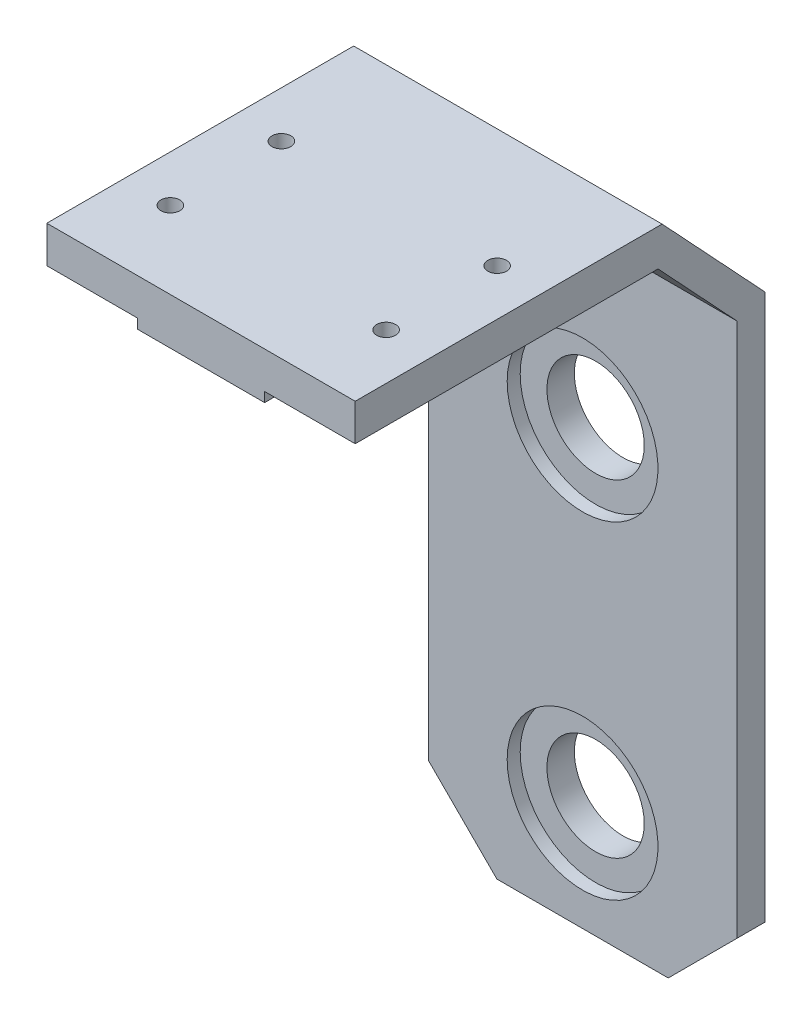
ISO-10303-21;
HEADER;
FILE_DESCRIPTION(('STEP AP214'),'2;1');
FILE_NAME('part.step','',(''),(''),'','','');
FILE_SCHEMA(('AUTOMOTIVE_DESIGN { 1 0 10303 214 1 1 1 1 }'));
ENDSEC;
DATA;
#1=APPLICATION_CONTEXT('core data for automotive mechanical design processes');
#2=APPLICATION_PROTOCOL_DEFINITION('international standard','automotive_design',2000,#1);
#3=PRODUCT_CONTEXT('',#1,'mechanical');
#4=PRODUCT('Part','Part','',(#3));
#5=PRODUCT_RELATED_PRODUCT_CATEGORY('part','',(#4));
#6=PRODUCT_DEFINITION_FORMATION('','',#4);
#7=PRODUCT_DEFINITION_CONTEXT('part definition',#1,'design');
#8=PRODUCT_DEFINITION('design','',#6,#7);
#9=PRODUCT_DEFINITION_SHAPE('','',#8);
#10=(LENGTH_UNIT() NAMED_UNIT(*) SI_UNIT(.MILLI.,.METRE.));
#11=(NAMED_UNIT(*) PLANE_ANGLE_UNIT() SI_UNIT($,.RADIAN.));
#12=(NAMED_UNIT(*) SI_UNIT($,.STERADIAN.) SOLID_ANGLE_UNIT());
#13=UNCERTAINTY_MEASURE_WITH_UNIT(LENGTH_MEASURE(1.E-05),#10,'distance_accuracy_value','');
#14=(GEOMETRIC_REPRESENTATION_CONTEXT(3) GLOBAL_UNCERTAINTY_ASSIGNED_CONTEXT((#13)) GLOBAL_UNIT_ASSIGNED_CONTEXT((#10,
#11,#12)) REPRESENTATION_CONTEXT('',''));
#15=CARTESIAN_POINT('',(0.,0.,0.));
#16=DIRECTION('',(0.,0.,1.));
#17=DIRECTION('',(1.,0.,0.));
#18=AXIS2_PLACEMENT_3D('',#15,#16,#17);
#19=CARTESIAN_POINT('',(0.,0.,4.));
#20=DIRECTION('',(0.,0.,-1.));
#21=DIRECTION('',(-1.,0.,0.));
#22=AXIS2_PLACEMENT_3D('',#19,#20,#21);
#23=PLANE('',#22);
#24=CARTESIAN_POINT('',(0.,19.65,4.));
#25=DIRECTION('',(0.,0.,1.));
#26=DIRECTION('',(1.,0.,0.));
#27=AXIS2_PLACEMENT_3D('',#24,#25,#26);
#28=CIRCLE('',#27,11.);
#29=CARTESIAN_POINT('',(-11.,19.65,4.));
#30=VERTEX_POINT('',#29);
#31=EDGE_CURVE('E210',#30,#30,#28,.T.);
#32=ORIENTED_EDGE('',*,*,#31,.T.);
#33=EDGE_LOOP('',(#32));
#34=FACE_BOUND('',#33,.T.);
#35=CARTESIAN_POINT('',(0.,19.65,4.));
#36=DIRECTION('',(0.,0.,1.));
#37=DIRECTION('',(1.,0.,0.));
#38=AXIS2_PLACEMENT_3D('',#35,#36,#37);
#39=CIRCLE('',#38,7.1);
#40=CARTESIAN_POINT('',(7.1,19.65,4.));
#41=VERTEX_POINT('',#40);
#42=EDGE_CURVE('E307',#41,#41,#39,.T.);
#43=ORIENTED_EDGE('',*,*,#42,.F.);
#44=EDGE_LOOP('',(#43));
#45=FACE_BOUND('',#44,.T.);
#46=ADVANCED_FACE('F45',(#34,#45),#23,.F.);
#47=CARTESIAN_POINT('',(-22.5,56.3434052044111,-0.001000000000001));
#48=DIRECTION('',(0.,-1.,0.));
#49=DIRECTION('',(1.,0.,0.));
#50=AXIS2_PLACEMENT_3D('',#47,#48,#49);
#51=PLANE('',#50);
#52=CARTESIAN_POINT('',(-15.7430140650594,56.3434052044111,50.2990425341615));
#53=DIRECTION('',(0.,-1.,0.));
#54=DIRECTION('',(1.,0.,0.));
#55=AXIS2_PLACEMENT_3D('',#52,#53,#54);
#56=CIRCLE('',#55,1.37500000000098);
#57=CARTESIAN_POINT('',(-14.3680140650584,56.3434052044111,50.2990425341615));
#58=VERTEX_POINT('',#57);
#59=EDGE_CURVE('E230',#58,#58,#56,.T.);
#60=ORIENTED_EDGE('',*,*,#59,.F.);
#61=EDGE_LOOP('',(#60));
#62=FACE_BOUND('',#61,.T.);
#63=CARTESIAN_POINT('',(-15.7430140650594,56.3434052044111,34.097127602533));
#64=DIRECTION('',(0.,-1.,0.));
#65=DIRECTION('',(1.,0.,0.));
#66=AXIS2_PLACEMENT_3D('',#63,#64,#65);
#67=CIRCLE('',#66,1.37500000000098);
#68=CARTESIAN_POINT('',(-14.3680140650584,56.3434052044111,34.097127602533));
#69=VERTEX_POINT('',#68);
#70=EDGE_CURVE('E227',#69,#69,#67,.T.);
#71=ORIENTED_EDGE('',*,*,#70,.F.);
#72=EDGE_LOOP('',(#71));
#73=FACE_BOUND('',#72,.T.);
#74=DIRECTION('',(0.,0.,1.));
#75=VECTOR('',#74,1.);
#76=CARTESIAN_POINT('',(-9.29301406505979,56.3434052044112,17.3859705314257));
#77=LINE('',#76,#75);
#78=CARTESIAN_POINT('',(-9.29301406505979,56.3434052044112,17.3859705314257));
#79=VERTEX_POINT('',#78);
#80=CARTESIAN_POINT('',(-9.29301406505979,56.3434052044112,61.5750000000001));
#81=VERTEX_POINT('',#80);
#82=EDGE_CURVE('E262',#79,#81,#77,.T.);
#83=ORIENTED_EDGE('',*,*,#82,.T.);
#84=DIRECTION('',(-1.,0.,0.));
#85=VECTOR('',#84,1.);
#86=CARTESIAN_POINT('',(-22.5,56.3434052044111,61.5750000000002));
#87=LINE('',#86,#85);
#88=CARTESIAN_POINT('',(-22.5,56.3434052044111,61.5750000000002));
#89=VERTEX_POINT('',#88);
#90=EDGE_CURVE('E275',#81,#89,#87,.T.);
#91=ORIENTED_EDGE('',*,*,#90,.T.);
#92=DIRECTION('',(0.,0.,1.));
#93=VECTOR('',#92,1.);
#94=CARTESIAN_POINT('',(-22.5,56.3434052044111,-0.001000000000001));
#95=LINE('',#94,#93);
#96=CARTESIAN_POINT('',(-22.5,56.3434052044111,17.3859705314257));
#97=VERTEX_POINT('',#96);
#98=EDGE_CURVE('E288',#97,#89,#95,.T.);
#99=ORIENTED_EDGE('',*,*,#98,.F.);
#100=DIRECTION('',(1.,0.,0.));
#101=VECTOR('',#100,1.);
#102=CARTESIAN_POINT('',(-49.4674388968405,56.3434052044112,17.3859705314257));
#103=LINE('',#102,#101);
#104=EDGE_CURVE('E296',#97,#79,#103,.T.);
#105=ORIENTED_EDGE('',*,*,#104,.T.);
#106=EDGE_LOOP('',(#83,#91,#99,#105));
#107=FACE_BOUND('',#106,.T.);
#108=ADVANCED_FACE('F415',(#62,#73,#107),#51,.T.);
#109=CARTESIAN_POINT('',(0.,-28.15,4.));
#110=DIRECTION('',(0.,0.,1.));
#111=DIRECTION('',(1.,0.,0.));
#112=AXIS2_PLACEMENT_3D('',#109,#110,#111);
#113=CIRCLE('',#112,11.);
#114=CARTESIAN_POINT('',(-11.,-28.15,4.));
#115=VERTEX_POINT('',#114);
#116=EDGE_CURVE('E207',#115,#115,#113,.T.);
#117=ORIENTED_EDGE('',*,*,#116,.T.);
#118=EDGE_LOOP('',(#117));
#119=FACE_BOUND('',#118,.T.);
#120=CARTESIAN_POINT('',(0.,-28.15,4.));
#121=DIRECTION('',(0.,0.,1.));
#122=DIRECTION('',(1.,0.,0.));
#123=AXIS2_PLACEMENT_3D('',#120,#121,#122);
#124=CIRCLE('',#123,7.1);
#125=CARTESIAN_POINT('',(7.1,-28.15,4.));
#126=VERTEX_POINT('',#125);
#127=EDGE_CURVE('E301',#126,#126,#124,.T.);
#128=ORIENTED_EDGE('',*,*,#127,.F.);
#129=EDGE_LOOP('',(#128));
#130=FACE_BOUND('',#129,.T.);
#131=ADVANCED_FACE('F437',(#119,#130),#23,.F.);
#132=CARTESIAN_POINT('',(0.,0.,0.));
#133=DIRECTION('',(0.,0.,-1.));
#134=DIRECTION('',(-1.,0.,0.));
#135=AXIS2_PLACEMENT_3D('',#132,#133,#134);
#136=PLANE('',#135);
#137=CARTESIAN_POINT('',(0.,19.65,0.));
#138=DIRECTION('',(0.,0.,1.));
#139=DIRECTION('',(1.,0.,0.));
#140=AXIS2_PLACEMENT_3D('',#137,#138,#139);
#141=CIRCLE('',#140,7.1);
#142=CARTESIAN_POINT('',(7.1,19.65,0.));
#143=VERTEX_POINT('',#142);
#144=EDGE_CURVE('E304',#143,#143,#141,.T.);
#145=ORIENTED_EDGE('',*,*,#144,.T.);
#146=EDGE_LOOP('',(#145));
#147=FACE_BOUND('',#146,.T.);
#148=DIRECTION('',(-0.707106781186546,0.707106781186549,0.));
#149=VECTOR('',#148,1.);
#150=CARTESIAN_POINT('',(-27.0125631329236,-27.0125631329235,0.));
#151=LINE('',#150,#149);
#152=CARTESIAN_POINT('',(-11.7751262658471,-42.25,0.));
#153=VERTEX_POINT('',#152);
#154=CARTESIAN_POINT('',(-20.75,-33.275126265847,0.));
#155=VERTEX_POINT('',#154);
#156=EDGE_CURVE('E339',#153,#155,#151,.T.);
#157=ORIENTED_EDGE('',*,*,#156,.T.);
#158=DIRECTION('',(0.,1.,0.));
#159=VECTOR('',#158,1.);
#160=CARTESIAN_POINT('',(-20.75,43.7206459778937,0.));
#161=LINE('',#160,#159);
#162=CARTESIAN_POINT('',(-20.75,43.7206459778937,0.));
#163=VERTEX_POINT('',#162);
#164=EDGE_CURVE('E341',#155,#163,#161,.T.);
#165=ORIENTED_EDGE('',*,*,#164,.T.);
#166=DIRECTION('',(1.,0.,0.));
#167=VECTOR('',#166,1.);
#168=CARTESIAN_POINT('',(-49.3860555271444,43.7206459778937,0.));
#169=LINE('',#168,#167);
#170=CARTESIAN_POINT('',(20.75,43.7206459778937,0.));
#171=VERTEX_POINT('',#170);
#172=EDGE_CURVE('E241',#163,#171,#169,.T.);
#173=ORIENTED_EDGE('',*,*,#172,.T.);
#174=DIRECTION('',(0.,-1.,0.));
#175=VECTOR('',#174,1.);
#176=CARTESIAN_POINT('',(20.75,-34.,0.));
#177=LINE('',#176,#175);
#178=CARTESIAN_POINT('',(20.75,-33.2751262658471,0.));
#179=VERTEX_POINT('',#178);
#180=EDGE_CURVE('E333',#171,#179,#177,.T.);
#181=ORIENTED_EDGE('',*,*,#180,.T.);
#182=DIRECTION('',(-0.707106781186549,-0.707106781186546,0.));
#183=VECTOR('',#182,1.);
#184=CARTESIAN_POINT('',(27.0125631329235,-27.0125631329236,0.));
#185=LINE('',#184,#183);
#186=CARTESIAN_POINT('',(11.775126265847,-42.25,0.));
#187=VERTEX_POINT('',#186);
#188=EDGE_CURVE('E335',#179,#187,#185,.T.);
#189=ORIENTED_EDGE('',*,*,#188,.T.);
#190=DIRECTION('',(-1.,0.,0.));
#191=VECTOR('',#190,1.);
#192=CARTESIAN_POINT('',(-12.5,-42.25,0.));
#193=LINE('',#192,#191);
#194=EDGE_CURVE('E337',#187,#153,#193,.T.);
#195=ORIENTED_EDGE('',*,*,#194,.T.);
#196=EDGE_LOOP('',(#157,#165,#173,#181,#189,#195));
#197=FACE_BOUND('',#196,.T.);
#198=CARTESIAN_POINT('',(0.,-28.15,0.));
#199=DIRECTION('',(0.,0.,1.));
#200=DIRECTION('',(1.,0.,0.));
#201=AXIS2_PLACEMENT_3D('',#198,#199,#200);
#202=CIRCLE('',#201,7.1);
#203=CARTESIAN_POINT('',(7.1,-28.15,0.));
#204=VERTEX_POINT('',#203);
#205=EDGE_CURVE('E295',#204,#204,#202,.T.);
#206=ORIENTED_EDGE('',*,*,#205,.T.);
#207=EDGE_LOOP('',(#206));
#208=FACE_BOUND('',#207,.T.);
#209=ADVANCED_FACE('F448',(#147,#197,#208),#136,.T.);
#210=CARTESIAN_POINT('',(-22.5,-44.,4.));
#211=DIRECTION('',(1.,0.,0.));
#212=DIRECTION('',(0.,1.,0.));
#213=AXIS2_PLACEMENT_3D('',#210,#211,#212);
#214=PLANE('',#213);
#215=DIRECTION('',(0.,-1.,0.));
#216=VECTOR('',#215,1.);
#217=CARTESIAN_POINT('',(-22.5,0.,5.9));
#218=LINE('',#217,#216);
#219=CARTESIAN_POINT('',(-22.5,44.0358979443741,5.9));
#220=VERTEX_POINT('',#219);
#221=CARTESIAN_POINT('',(-22.5,-34.,5.9));
#222=VERTEX_POINT('',#221);
#223=EDGE_CURVE('E194',#220,#222,#218,.T.);
#224=ORIENTED_EDGE('',*,*,#223,.F.);
#225=DIRECTION('',(0.,0.731085971705988,0.682285352308484));
#226=VECTOR('',#225,1.);
#227=CARTESIAN_POINT('',(-22.5,42.,4.));
#228=LINE('',#227,#226);
#229=EDGE_CURVE('E64',#220,#97,#228,.T.);
#230=ORIENTED_EDGE('',*,*,#229,.T.);
#231=ORIENTED_EDGE('',*,*,#98,.T.);
#232=DIRECTION('',(0.,1.,0.));
#233=VECTOR('',#232,1.);
#234=CARTESIAN_POINT('',(-22.5,61.7155162704073,61.5750000000002));
#235=LINE('',#234,#233);
#236=CARTESIAN_POINT('',(-22.5,61.7155162704073,61.5750000000002));
#237=VERTEX_POINT('',#236);
#238=EDGE_CURVE('E278',#89,#237,#235,.T.);
#239=ORIENTED_EDGE('',*,*,#238,.T.);
#240=DIRECTION('',(0.,0.,-1.));
#241=VECTOR('',#240,1.);
#242=CARTESIAN_POINT('',(-22.5,61.7155162704073,58.28));
#243=LINE('',#242,#241);
#244=CARTESIAN_POINT('',(-22.5,61.7155162704073,16.7936971743874));
#245=VERTEX_POINT('',#244);
#246=EDGE_CURVE('E281',#237,#245,#243,.T.);
#247=ORIENTED_EDGE('',*,*,#246,.T.);
#248=DIRECTION('',(0.,-0.731085971705988,-0.682285352308484));
#249=VECTOR('',#248,1.);
#250=CARTESIAN_POINT('',(-22.5,61.7155162704073,16.7936971743874));
#251=LINE('',#250,#249);
#252=CARTESIAN_POINT('',(-22.5,45.5958151371856,1.74999999999998));
#253=VERTEX_POINT('',#252);
#254=EDGE_CURVE('E235',#245,#253,#251,.T.);
#255=ORIENTED_EDGE('',*,*,#254,.T.);
#256=DIRECTION('',(0.,-1.,0.));
#257=VECTOR('',#256,1.);
#258=CARTESIAN_POINT('',(-22.5,-33.9999999999999,1.74999999999999));
#259=LINE('',#258,#257);
#260=CARTESIAN_POINT('',(-22.5,-33.9999999999999,1.74999999999999));
#261=VERTEX_POINT('',#260);
#262=EDGE_CURVE('E330',#253,#261,#259,.T.);
#263=ORIENTED_EDGE('',*,*,#262,.T.);
#264=DIRECTION('',(0.,0.,1.));
#265=VECTOR('',#264,1.);
#266=CARTESIAN_POINT('',(-22.5,-33.9999999999999,4.));
#267=LINE('',#266,#265);
#268=EDGE_CURVE('E328',#261,#222,#267,.T.);
#269=ORIENTED_EDGE('',*,*,#268,.T.);
#270=EDGE_LOOP('',(#224,#230,#231,#239,#247,#255,#263,#269));
#271=FACE_BOUND('',#270,.T.);
#272=ADVANCED_FACE('F454',(#271),#214,.F.);
#273=CARTESIAN_POINT('',(-22.5,-44.,4.));
#274=DIRECTION('',(0.,1.,0.));
#275=DIRECTION('',(0.,0.,1.));
#276=AXIS2_PLACEMENT_3D('',#273,#274,#275);
#277=PLANE('',#276);
#278=DIRECTION('',(0.,0.,-1.));
#279=VECTOR('',#278,1.);
#280=CARTESIAN_POINT('',(-12.5,-44.,4.));
#281=LINE('',#280,#279);
#282=CARTESIAN_POINT('',(-12.5,-44.,5.9));
#283=VERTEX_POINT('',#282);
#284=CARTESIAN_POINT('',(-12.5,-44.,1.74999999999999));
#285=VERTEX_POINT('',#284);
#286=EDGE_CURVE('E168',#283,#285,#281,.T.);
#287=ORIENTED_EDGE('',*,*,#286,.T.);
#288=DIRECTION('',(1.,0.,0.));
#289=VECTOR('',#288,1.);
#290=CARTESIAN_POINT('',(12.4999999999999,-44.,1.74999999999999));
#291=LINE('',#290,#289);
#292=CARTESIAN_POINT('',(12.4999999999999,-44.,1.74999999999999));
#293=VERTEX_POINT('',#292);
#294=EDGE_CURVE('E348',#285,#293,#291,.T.);
#295=ORIENTED_EDGE('',*,*,#294,.T.);
#296=DIRECTION('',(0.,0.,1.));
#297=VECTOR('',#296,1.);
#298=CARTESIAN_POINT('',(12.4999999999999,-44.,4.));
#299=LINE('',#298,#297);
#300=CARTESIAN_POINT('',(12.5,-44.,5.9));
#301=VERTEX_POINT('',#300);
#302=EDGE_CURVE('E178',#293,#301,#299,.T.);
#303=ORIENTED_EDGE('',*,*,#302,.T.);
#304=DIRECTION('',(1.,0.,0.));
#305=VECTOR('',#304,1.);
#306=CARTESIAN_POINT('',(0.,-44.,5.9));
#307=LINE('',#306,#305);
#308=EDGE_CURVE('E182',#283,#301,#307,.T.);
#309=ORIENTED_EDGE('',*,*,#308,.F.);
#310=EDGE_LOOP('',(#287,#295,#303,#309));
#311=FACE_BOUND('',#310,.T.);
#312=ADVANCED_FACE('F183',(#311),#277,.F.);
#313=CARTESIAN_POINT('',(22.5,-44.,4.));
#314=DIRECTION('',(-1.,0.,0.));
#315=DIRECTION('',(0.,-1.,0.));
#316=AXIS2_PLACEMENT_3D('',#313,#314,#315);
#317=PLANE('',#316);
#318=DIRECTION('',(0.,-0.731085971705988,-0.682285352308484));
#319=VECTOR('',#318,1.);
#320=CARTESIAN_POINT('',(22.5,42.,4.));
#321=LINE('',#320,#319);
#322=CARTESIAN_POINT('',(22.5,56.3434052044112,17.3859705314257));
#323=VERTEX_POINT('',#322);
#324=CARTESIAN_POINT('',(22.5,44.0358979443741,5.9));
#325=VERTEX_POINT('',#324);
#326=EDGE_CURVE('E291',#323,#325,#321,.T.);
#327=ORIENTED_EDGE('',*,*,#326,.T.);
#328=DIRECTION('',(0.,1.,0.));
#329=VECTOR('',#328,1.);
#330=CARTESIAN_POINT('',(22.5,0.,5.9));
#331=LINE('',#330,#329);
#332=CARTESIAN_POINT('',(22.5,-34.,5.9));
#333=VERTEX_POINT('',#332);
#334=EDGE_CURVE('E203',#333,#325,#331,.T.);
#335=ORIENTED_EDGE('',*,*,#334,.F.);
#336=DIRECTION('',(0.,0.,-1.));
#337=VECTOR('',#336,1.);
#338=CARTESIAN_POINT('',(22.5,-34.,4.));
#339=LINE('',#338,#337);
#340=CARTESIAN_POINT('',(22.5,-34.,1.74999999999999));
#341=VERTEX_POINT('',#340);
#342=EDGE_CURVE('E179',#333,#341,#339,.T.);
#343=ORIENTED_EDGE('',*,*,#342,.T.);
#344=DIRECTION('',(0.,1.,0.));
#345=VECTOR('',#344,1.);
#346=CARTESIAN_POINT('',(22.5,43.7206459778937,1.74999999999999));
#347=LINE('',#346,#345);
#348=CARTESIAN_POINT('',(22.5,45.5958151371856,1.74999999999998));
#349=VERTEX_POINT('',#348);
#350=EDGE_CURVE('E54',#341,#349,#347,.T.);
#351=ORIENTED_EDGE('',*,*,#350,.T.);
#352=DIRECTION('',(0.,0.731085971705988,0.682285352308484));
#353=VECTOR('',#352,1.);
#354=CARTESIAN_POINT('',(22.5,61.7155162704073,16.7936971743874));
#355=LINE('',#354,#353);
#356=CARTESIAN_POINT('',(22.5,61.7155162704073,16.7936971743874));
#357=VERTEX_POINT('',#356);
#358=EDGE_CURVE('E234',#349,#357,#355,.T.);
#359=ORIENTED_EDGE('',*,*,#358,.T.);
#360=DIRECTION('',(0.,0.,-1.));
#361=VECTOR('',#360,1.);
#362=CARTESIAN_POINT('',(22.5,61.7155162704073,58.28));
#363=LINE('',#362,#361);
#364=CARTESIAN_POINT('',(22.5,61.7155162704073,61.5750000000001));
#365=VERTEX_POINT('',#364);
#366=EDGE_CURVE('E285',#365,#357,#363,.T.);
#367=ORIENTED_EDGE('',*,*,#366,.F.);
#368=DIRECTION('',(0.,-1.,0.));
#369=VECTOR('',#368,1.);
#370=CARTESIAN_POINT('',(22.5,56.3434052044112,61.5750000000001));
#371=LINE('',#370,#369);
#372=CARTESIAN_POINT('',(22.5,56.3434052044112,61.5750000000001));
#373=VERTEX_POINT('',#372);
#374=EDGE_CURVE('E272',#365,#373,#371,.T.);
#375=ORIENTED_EDGE('',*,*,#374,.T.);
#376=DIRECTION('',(0.,0.,1.));
#377=VECTOR('',#376,1.);
#378=CARTESIAN_POINT('',(22.5,56.3434052044112,-0.001000000000001));
#379=LINE('',#378,#377);
#380=EDGE_CURVE('E289',#323,#373,#379,.T.);
#381=ORIENTED_EDGE('',*,*,#380,.F.);
#382=EDGE_LOOP('',(#327,#335,#343,#351,#359,#367,#375,#381));
#383=FACE_BOUND('',#382,.T.);
#384=ADVANCED_FACE('F372',(#383),#317,.F.);
#385=CARTESIAN_POINT('',(0.,19.65,4.));
#386=DIRECTION('',(0.,0.,-1.));
#387=DIRECTION('',(-1.,0.,0.));
#388=AXIS2_PLACEMENT_3D('',#385,#386,#387);
#389=CYLINDRICAL_SURFACE('',#388,7.1);
#390=ORIENTED_EDGE('',*,*,#42,.T.);
#391=EDGE_LOOP('',(#390));
#392=FACE_BOUND('',#391,.T.);
#393=ORIENTED_EDGE('',*,*,#144,.F.);
#394=EDGE_LOOP('',(#393));
#395=FACE_BOUND('',#394,.T.);
#396=ADVANCED_FACE('F463',(#392,#395),#389,.F.);
#397=CARTESIAN_POINT('',(0.,-28.15,4.));
#398=DIRECTION('',(0.,0.,-1.));
#399=DIRECTION('',(-1.,0.,0.));
#400=AXIS2_PLACEMENT_3D('',#397,#398,#399);
#401=CYLINDRICAL_SURFACE('',#400,7.1);
#402=ORIENTED_EDGE('',*,*,#127,.T.);
#403=EDGE_LOOP('',(#402));
#404=FACE_BOUND('',#403,.T.);
#405=ORIENTED_EDGE('',*,*,#205,.F.);
#406=EDGE_LOOP('',(#405));
#407=FACE_BOUND('',#406,.T.);
#408=ADVANCED_FACE('F460',(#404,#407),#401,.F.);
#409=CARTESIAN_POINT('',(-49.4674388968405,42.,4.));
#410=DIRECTION('',(0.,-0.682285352308484,0.731085971705988));
#411=DIRECTION('',(0.,-0.731085971705988,-0.682285352308484));
#412=AXIS2_PLACEMENT_3D('',#409,#410,#411);
#413=PLANE('',#412);
#414=DIRECTION('',(-1.,0.,0.));
#415=VECTOR('',#414,1.);
#416=CARTESIAN_POINT('',(-49.4674388968405,44.0358979443741,5.9));
#417=LINE('',#416,#415);
#418=EDGE_CURVE('E11',#325,#220,#417,.T.);
#419=ORIENTED_EDGE('',*,*,#418,.F.);
#420=ORIENTED_EDGE('',*,*,#326,.F.);
#421=CARTESIAN_POINT('',(9.28677330455362,56.3434052044112,17.3859705314257));
#422=VERTEX_POINT('',#421);
#423=EDGE_CURVE('E298',#422,#323,#103,.T.);
#424=ORIENTED_EDGE('',*,*,#423,.F.);
#425=DIRECTION('',(-1.,0.,0.));
#426=VECTOR('',#425,1.);
#427=CARTESIAN_POINT('',(-9.29301406505979,56.3434052044112,17.3859705314257));
#428=LINE('',#427,#426);
#429=EDGE_CURVE('E252',#422,#79,#428,.T.);
#430=ORIENTED_EDGE('',*,*,#429,.T.);
#431=ORIENTED_EDGE('',*,*,#104,.F.);
#432=ORIENTED_EDGE('',*,*,#229,.F.);
#433=EDGE_LOOP('',(#419,#420,#424,#430,#431,#432));
#434=FACE_BOUND('',#433,.T.);
#435=ADVANCED_FACE('F417',(#434),#413,.T.);
#436=CARTESIAN_POINT('',(22.5,61.7155162704073,58.28));
#437=DIRECTION('',(0.,-1.,0.));
#438=DIRECTION('',(1.,0.,0.));
#439=AXIS2_PLACEMENT_3D('',#436,#437,#438);
#440=PLANE('',#439);
#441=CARTESIAN_POINT('',(-15.7430140650594,61.7155162704073,50.2990425341615));
#442=DIRECTION('',(0.,1.,0.));
#443=DIRECTION('',(-1.,0.,0.));
#444=AXIS2_PLACEMENT_3D('',#441,#442,#443);
#445=CIRCLE('',#444,1.37500000000098);
#446=CARTESIAN_POINT('',(-17.1180140650603,61.7155162704073,50.2990425341615));
#447=VERTEX_POINT('',#446);
#448=EDGE_CURVE('E220',#447,#447,#445,.T.);
#449=ORIENTED_EDGE('',*,*,#448,.F.);
#450=EDGE_LOOP('',(#449));
#451=FACE_BOUND('',#450,.T.);
#452=CARTESIAN_POINT('',(-15.7430140650594,61.7155162704073,34.097127602533));
#453=DIRECTION('',(0.,1.,0.));
#454=DIRECTION('',(-1.,0.,0.));
#455=AXIS2_PLACEMENT_3D('',#452,#453,#454);
#456=CIRCLE('',#455,1.37500000000098);
#457=CARTESIAN_POINT('',(-17.1180140650603,61.7155162704073,34.097127602533));
#458=VERTEX_POINT('',#457);
#459=EDGE_CURVE('E217',#458,#458,#456,.T.);
#460=ORIENTED_EDGE('',*,*,#459,.F.);
#461=EDGE_LOOP('',(#460));
#462=FACE_BOUND('',#461,.T.);
#463=CARTESIAN_POINT('',(15.7349999999804,61.7155162704073,34.0971276025452));
#464=DIRECTION('',(0.,1.,0.));
#465=DIRECTION('',(-1.,0.,0.));
#466=AXIS2_PLACEMENT_3D('',#463,#464,#465);
#467=CIRCLE('',#466,1.37500000001583);
#468=CARTESIAN_POINT('',(14.3599999999646,61.7155162704073,34.0971276025452));
#469=VERTEX_POINT('',#468);
#470=EDGE_CURVE('E213',#469,#469,#467,.T.);
#471=ORIENTED_EDGE('',*,*,#470,.F.);
#472=EDGE_LOOP('',(#471));
#473=FACE_BOUND('',#472,.T.);
#474=CARTESIAN_POINT('',(15.7349999999804,61.7155162704073,50.2990425341737));
#475=DIRECTION('',(0.,1.,0.));
#476=DIRECTION('',(-1.,0.,0.));
#477=AXIS2_PLACEMENT_3D('',#474,#475,#476);
#478=CIRCLE('',#477,1.37500000000158);
#479=CARTESIAN_POINT('',(14.3599999999788,61.7155162704073,50.2990425341737));
#480=VERTEX_POINT('',#479);
#481=EDGE_CURVE('E216',#480,#480,#478,.T.);
#482=ORIENTED_EDGE('',*,*,#481,.F.);
#483=EDGE_LOOP('',(#482));
#484=FACE_BOUND('',#483,.T.);
#485=ORIENTED_EDGE('',*,*,#366,.T.);
#486=DIRECTION('',(1.,0.,0.));
#487=VECTOR('',#486,1.);
#488=CARTESIAN_POINT('',(-49.3860555271444,61.7155162704073,16.7936971743874));
#489=LINE('',#488,#487);
#490=EDGE_CURVE('E239',#245,#357,#489,.T.);
#491=ORIENTED_EDGE('',*,*,#490,.F.);
#492=ORIENTED_EDGE('',*,*,#246,.F.);
#493=DIRECTION('',(1.,0.,0.));
#494=VECTOR('',#493,1.);
#495=CARTESIAN_POINT('',(22.5,61.7155162704073,61.5750000000001));
#496=LINE('',#495,#494);
#497=EDGE_CURVE('E265',#237,#365,#496,.T.);
#498=ORIENTED_EDGE('',*,*,#497,.T.);
#499=EDGE_LOOP('',(#485,#491,#492,#498));
#500=FACE_BOUND('',#499,.T.);
#501=ADVANCED_FACE('F380',(#451,#462,#473,#484,#500),#440,.F.);
#502=CARTESIAN_POINT('',(15.7349999999804,56.3434052044112,34.0971276025452));
#503=DIRECTION('',(0.,-1.,0.));
#504=DIRECTION('',(1.,0.,0.));
#505=AXIS2_PLACEMENT_3D('',#502,#503,#504);
#506=CIRCLE('',#505,1.37500000001583);
#507=CARTESIAN_POINT('',(17.1099999999963,56.3434052044112,34.0971276025452));
#508=VERTEX_POINT('',#507);
#509=EDGE_CURVE('E231',#508,#508,#506,.T.);
#510=ORIENTED_EDGE('',*,*,#509,.F.);
#511=EDGE_LOOP('',(#510));
#512=FACE_BOUND('',#511,.T.);
#513=CARTESIAN_POINT('',(15.7349999999804,56.3434052044112,50.2990425341737));
#514=DIRECTION('',(0.,-1.,0.));
#515=DIRECTION('',(1.,0.,0.));
#516=AXIS2_PLACEMENT_3D('',#513,#514,#515);
#517=CIRCLE('',#516,1.37500000000158);
#518=CARTESIAN_POINT('',(17.109999999982,56.3434052044112,50.2990425341737));
#519=VERTEX_POINT('',#518);
#520=EDGE_CURVE('E226',#519,#519,#517,.T.);
#521=ORIENTED_EDGE('',*,*,#520,.F.);
#522=EDGE_LOOP('',(#521));
#523=FACE_BOUND('',#522,.T.);
#524=DIRECTION('',(0.,0.,1.));
#525=VECTOR('',#524,1.);
#526=CARTESIAN_POINT('',(9.28677330455362,56.3434052044112,17.3859705314257));
#527=LINE('',#526,#525);
#528=CARTESIAN_POINT('',(9.28677330455362,56.3434052044112,61.5750000000001));
#529=VERTEX_POINT('',#528);
#530=EDGE_CURVE('E266',#422,#529,#527,.T.);
#531=ORIENTED_EDGE('',*,*,#530,.F.);
#532=ORIENTED_EDGE('',*,*,#423,.T.);
#533=ORIENTED_EDGE('',*,*,#380,.T.);
#534=EDGE_CURVE('E276',#373,#529,#87,.T.);
#535=ORIENTED_EDGE('',*,*,#534,.T.);
#536=EDGE_LOOP('',(#531,#532,#533,#535));
#537=FACE_BOUND('',#536,.T.);
#538=ADVANCED_FACE('F391',(#512,#523,#537),#51,.T.);
#539=CARTESIAN_POINT('',(15.7349999999983,55.0399999999998,61.5750000000001));
#540=DIRECTION('',(0.,0.,-1.));
#541=DIRECTION('',(-1.,0.,0.));
#542=AXIS2_PLACEMENT_3D('',#539,#540,#541);
#543=PLANE('',#542);
#544=ORIENTED_EDGE('',*,*,#534,.F.);
#545=ORIENTED_EDGE('',*,*,#374,.F.);
#546=ORIENTED_EDGE('',*,*,#497,.F.);
#547=ORIENTED_EDGE('',*,*,#238,.F.);
#548=ORIENTED_EDGE('',*,*,#90,.F.);
#549=DIRECTION('',(0.,-1.,0.));
#550=VECTOR('',#549,1.);
#551=CARTESIAN_POINT('',(-9.29301406505979,56.3434052044112,61.5750000000001));
#552=LINE('',#551,#550);
#553=CARTESIAN_POINT('',(-9.29301406505979,54.9336977234331,61.5750000000001));
#554=VERTEX_POINT('',#553);
#555=EDGE_CURVE('E238',#81,#554,#552,.T.);
#556=ORIENTED_EDGE('',*,*,#555,.T.);
#557=DIRECTION('',(1.,0.,0.));
#558=VECTOR('',#557,1.);
#559=CARTESIAN_POINT('',(-9.29301406505979,54.9336977234331,61.5750000000001));
#560=LINE('',#559,#558);
#561=CARTESIAN_POINT('',(9.28677330455361,54.9336977234331,61.5750000000001));
#562=VERTEX_POINT('',#561);
#563=EDGE_CURVE('E257',#554,#562,#560,.T.);
#564=ORIENTED_EDGE('',*,*,#563,.T.);
#565=DIRECTION('',(0.,1.,0.));
#566=VECTOR('',#565,1.);
#567=CARTESIAN_POINT('',(9.28677330455362,56.3434052044112,61.5750000000001));
#568=LINE('',#567,#566);
#569=EDGE_CURVE('E250',#562,#529,#568,.T.);
#570=ORIENTED_EDGE('',*,*,#569,.T.);
#571=EDGE_LOOP('',(#544,#545,#546,#547,#548,#556,#564,#570));
#572=FACE_BOUND('',#571,.T.);
#573=ADVANCED_FACE('F386',(#572),#543,.F.);
#574=CARTESIAN_POINT('',(-9.29301406505979,56.3434052044112,17.3859705314257));
#575=DIRECTION('',(-1.,0.,0.));
#576=DIRECTION('',(0.,0.,1.));
#577=AXIS2_PLACEMENT_3D('',#574,#575,#576);
#578=PLANE('',#577);
#579=DIRECTION('',(0.,-1.,0.));
#580=VECTOR('',#579,1.);
#581=CARTESIAN_POINT('',(-9.29301406505979,56.3434052044112,17.3859705314257));
#582=LINE('',#581,#580);
#583=CARTESIAN_POINT('',(-9.29301406505979,56.3386977234331,17.3859705314257));
#584=VERTEX_POINT('',#583);
#585=EDGE_CURVE('E246',#79,#584,#582,.T.);
#586=ORIENTED_EDGE('',*,*,#585,.T.);
#587=DIRECTION('',(0.,-0.707106781186544,0.707106781186551));
#588=VECTOR('',#587,1.);
#589=CARTESIAN_POINT('',(-9.29301406505979,56.3410514639221,17.3836167909366));
#590=LINE('',#589,#588);
#591=CARTESIAN_POINT('',(-9.29301406505979,54.9336977234331,18.7909705314257));
#592=VERTEX_POINT('',#591);
#593=EDGE_CURVE('E319',#584,#592,#590,.T.);
#594=ORIENTED_EDGE('',*,*,#593,.T.);
#595=DIRECTION('',(0.,0.,1.));
#596=VECTOR('',#595,1.);
#597=CARTESIAN_POINT('',(-9.29301406505979,54.9336977234331,17.3859705314257));
#598=LINE('',#597,#596);
#599=EDGE_CURVE('E254',#592,#554,#598,.T.);
#600=ORIENTED_EDGE('',*,*,#599,.T.);
#601=ORIENTED_EDGE('',*,*,#555,.F.);
#602=ORIENTED_EDGE('',*,*,#82,.F.);
#603=EDGE_LOOP('',(#586,#594,#600,#601,#602));
#604=FACE_BOUND('',#603,.T.);
#605=ADVANCED_FACE('F408',(#604),#578,.T.);
#606=CARTESIAN_POINT('',(9.28677330455362,56.3434052044112,17.3859705314257));
#607=DIRECTION('',(1.,0.,0.));
#608=DIRECTION('',(0.,1.,0.));
#609=AXIS2_PLACEMENT_3D('',#606,#607,#608);
#610=PLANE('',#609);
#611=DIRECTION('',(0.,0.,1.));
#612=VECTOR('',#611,1.);
#613=CARTESIAN_POINT('',(9.28677330455361,54.9336977234331,17.3859705314257));
#614=LINE('',#613,#612);
#615=CARTESIAN_POINT('',(9.28677330455361,54.9336977234331,18.7909705314257));
#616=VERTEX_POINT('',#615);
#617=EDGE_CURVE('E269',#616,#562,#614,.T.);
#618=ORIENTED_EDGE('',*,*,#617,.F.);
#619=DIRECTION('',(0.,0.707106781186544,-0.707106781186551));
#620=VECTOR('',#619,1.);
#621=CARTESIAN_POINT('',(9.28677330455362,56.3410514639221,17.3836167909366));
#622=LINE('',#621,#620);
#623=CARTESIAN_POINT('',(9.28677330455362,56.3386977234331,17.3859705314257));
#624=VERTEX_POINT('',#623);
#625=EDGE_CURVE('E315',#616,#624,#622,.T.);
#626=ORIENTED_EDGE('',*,*,#625,.T.);
#627=DIRECTION('',(0.,1.,0.));
#628=VECTOR('',#627,1.);
#629=CARTESIAN_POINT('',(9.28677330455362,56.3434052044112,17.3859705314257));
#630=LINE('',#629,#628);
#631=EDGE_CURVE('E249',#624,#422,#630,.T.);
#632=ORIENTED_EDGE('',*,*,#631,.T.);
#633=ORIENTED_EDGE('',*,*,#530,.T.);
#634=ORIENTED_EDGE('',*,*,#569,.F.);
#635=EDGE_LOOP('',(#618,#626,#632,#633,#634));
#636=FACE_BOUND('',#635,.T.);
#637=ADVANCED_FACE('F395',(#636),#610,.T.);
#638=CARTESIAN_POINT('',(-9.29301406505979,54.9336977234331,17.3859705314257));
#639=DIRECTION('',(0.,-1.,0.));
#640=DIRECTION('',(0.,0.,-1.));
#641=AXIS2_PLACEMENT_3D('',#638,#639,#640);
#642=PLANE('',#641);
#643=ORIENTED_EDGE('',*,*,#599,.F.);
#644=DIRECTION('',(1.,0.,0.));
#645=VECTOR('',#644,1.);
#646=CARTESIAN_POINT('',(9.28677330455361,54.9336977234331,18.7909705314257));
#647=LINE('',#646,#645);
#648=EDGE_CURVE('E310',#592,#616,#647,.T.);
#649=ORIENTED_EDGE('',*,*,#648,.T.);
#650=ORIENTED_EDGE('',*,*,#617,.T.);
#651=ORIENTED_EDGE('',*,*,#563,.F.);
#652=EDGE_LOOP('',(#643,#649,#650,#651));
#653=FACE_BOUND('',#652,.T.);
#654=ADVANCED_FACE('F413',(#653),#642,.T.);
#655=CARTESIAN_POINT('',(0.,0.,17.3859705314257));
#656=DIRECTION('',(0.,0.,1.));
#657=DIRECTION('',(1.,0.,0.));
#658=AXIS2_PLACEMENT_3D('',#655,#656,#657);
#659=PLANE('',#658);
#660=ORIENTED_EDGE('',*,*,#631,.F.);
#661=DIRECTION('',(-1.,0.,0.));
#662=VECTOR('',#661,1.);
#663=CARTESIAN_POINT('',(-9.29301406505979,56.3386977234331,17.3859705314257));
#664=LINE('',#663,#662);
#665=EDGE_CURVE('E317',#624,#584,#664,.T.);
#666=ORIENTED_EDGE('',*,*,#665,.T.);
#667=ORIENTED_EDGE('',*,*,#585,.F.);
#668=ORIENTED_EDGE('',*,*,#429,.F.);
#669=EDGE_LOOP('',(#660,#666,#667,#668));
#670=FACE_BOUND('',#669,.T.);
#671=ADVANCED_FACE('F400',(#670),#659,.F.);
#672=CARTESIAN_POINT('',(-9.29301406505979,54.9336977234331,18.7909705314257));
#673=DIRECTION('',(0.,-0.707106781186551,-0.707106781186544));
#674=DIRECTION('',(-1.,0.,0.));
#675=AXIS2_PLACEMENT_3D('',#672,#673,#674);
#676=PLANE('',#675);
#677=ORIENTED_EDGE('',*,*,#593,.F.);
#678=ORIENTED_EDGE('',*,*,#665,.F.);
#679=ORIENTED_EDGE('',*,*,#625,.F.);
#680=ORIENTED_EDGE('',*,*,#648,.F.);
#681=EDGE_LOOP('',(#677,#678,#679,#680));
#682=FACE_BOUND('',#681,.T.);
#683=ADVANCED_FACE('F404',(#682),#676,.T.);
#684=CARTESIAN_POINT('',(-49.3860555271444,61.7155162704073,16.7936971743874));
#685=DIRECTION('',(0.,0.682285352308484,-0.731085971705988));
#686=DIRECTION('',(0.,0.731085971705988,0.682285352308484));
#687=AXIS2_PLACEMENT_3D('',#684,#685,#686);
#688=PLANE('',#687);
#689=ORIENTED_EDGE('',*,*,#172,.F.);
#690=DIRECTION('',(-0.563600234749781,0.603911873355694,0.563600234749781));
#691=VECTOR('',#690,1.);
#692=CARTESIAN_POINT('',(-41.3053657532611,65.7462390741681,20.5553657532611));
#693=LINE('',#692,#691);
#694=EDGE_CURVE('E345',#163,#253,#693,.T.);
#695=ORIENTED_EDGE('',*,*,#694,.T.);
#696=ORIENTED_EDGE('',*,*,#254,.F.);
#697=ORIENTED_EDGE('',*,*,#490,.T.);
#698=ORIENTED_EDGE('',*,*,#358,.F.);
#699=DIRECTION('',(-0.56360023474978,-0.603911873355694,-0.563600234749781));
#700=VECTOR('',#699,1.);
#701=CARTESIAN_POINT('',(9.93087635221688,32.1276819808145,-10.8191236477831));
#702=LINE('',#701,#700);
#703=EDGE_CURVE('E343',#349,#171,#702,.T.);
#704=ORIENTED_EDGE('',*,*,#703,.T.);
#705=EDGE_LOOP('',(#689,#695,#696,#697,#698,#704));
#706=FACE_BOUND('',#705,.T.);
#707=ADVANCED_FACE('F376',(#706),#688,.T.);
#708=CARTESIAN_POINT('',(15.7349999999804,-44.,50.2990425341737));
#709=DIRECTION('',(0.,1.,0.));
#710=DIRECTION('',(-1.,0.,0.));
#711=AXIS2_PLACEMENT_3D('',#708,#709,#710);
#712=CYLINDRICAL_SURFACE('',#711,1.37500000000158);
#713=ORIENTED_EDGE('',*,*,#520,.T.);
#714=EDGE_LOOP('',(#713));
#715=FACE_BOUND('',#714,.T.);
#716=ORIENTED_EDGE('',*,*,#481,.T.);
#717=EDGE_LOOP('',(#716));
#718=FACE_BOUND('',#717,.T.);
#719=ADVANCED_FACE('F490',(#715,#718),#712,.F.);
#720=CARTESIAN_POINT('',(15.7349999999804,-44.,34.0971276025452));
#721=DIRECTION('',(0.,1.,0.));
#722=DIRECTION('',(-1.,0.,0.));
#723=AXIS2_PLACEMENT_3D('',#720,#721,#722);
#724=CYLINDRICAL_SURFACE('',#723,1.37500000001583);
#725=ORIENTED_EDGE('',*,*,#509,.T.);
#726=EDGE_LOOP('',(#725));
#727=FACE_BOUND('',#726,.T.);
#728=ORIENTED_EDGE('',*,*,#470,.T.);
#729=EDGE_LOOP('',(#728));
#730=FACE_BOUND('',#729,.T.);
#731=ADVANCED_FACE('F492',(#727,#730),#724,.F.);
#732=CARTESIAN_POINT('',(-15.7430140650594,-44.,34.097127602533));
#733=DIRECTION('',(0.,1.,0.));
#734=DIRECTION('',(-1.,0.,0.));
#735=AXIS2_PLACEMENT_3D('',#732,#733,#734);
#736=CYLINDRICAL_SURFACE('',#735,1.37500000000098);
#737=ORIENTED_EDGE('',*,*,#70,.T.);
#738=EDGE_LOOP('',(#737));
#739=FACE_BOUND('',#738,.T.);
#740=ORIENTED_EDGE('',*,*,#459,.T.);
#741=EDGE_LOOP('',(#740));
#742=FACE_BOUND('',#741,.T.);
#743=ADVANCED_FACE('F429',(#739,#742),#736,.F.);
#744=CARTESIAN_POINT('',(-15.7430140650594,-44.,50.2990425341615));
#745=DIRECTION('',(0.,1.,0.));
#746=DIRECTION('',(-1.,0.,0.));
#747=AXIS2_PLACEMENT_3D('',#744,#745,#746);
#748=CYLINDRICAL_SURFACE('',#747,1.37500000000098);
#749=ORIENTED_EDGE('',*,*,#59,.T.);
#750=EDGE_LOOP('',(#749));
#751=FACE_BOUND('',#750,.T.);
#752=ORIENTED_EDGE('',*,*,#448,.T.);
#753=EDGE_LOOP('',(#752));
#754=FACE_BOUND('',#753,.T.);
#755=ADVANCED_FACE('F421',(#751,#754),#748,.F.);
#756=CARTESIAN_POINT('',(22.5,-34.,4.));
#757=DIRECTION('',(-0.707106781186546,0.707106781186549,0.));
#758=DIRECTION('',(0.,0.,-1.));
#759=AXIS2_PLACEMENT_3D('',#756,#757,#758);
#760=PLANE('',#759);
#761=ORIENTED_EDGE('',*,*,#302,.F.);
#762=DIRECTION('',(-0.707106781186549,-0.707106781186546,0.));
#763=VECTOR('',#762,1.);
#764=CARTESIAN_POINT('',(22.5,-34.,1.74999999999999));
#765=LINE('',#764,#763);
#766=EDGE_CURVE('E350',#293,#341,#765,.F.);
#767=ORIENTED_EDGE('',*,*,#766,.T.);
#768=ORIENTED_EDGE('',*,*,#342,.F.);
#769=DIRECTION('',(0.707106781186549,0.707106781186546,0.));
#770=VECTOR('',#769,1.);
#771=CARTESIAN_POINT('',(28.25,-28.2500000000001,5.9));
#772=LINE('',#771,#770);
#773=EDGE_CURVE('E188',#301,#333,#772,.T.);
#774=ORIENTED_EDGE('',*,*,#773,.F.);
#775=EDGE_LOOP('',(#761,#767,#768,#774));
#776=FACE_BOUND('',#775,.T.);
#777=ADVANCED_FACE('F419',(#776),#760,.F.);
#778=CARTESIAN_POINT('',(-12.5,-44.,4.));
#779=DIRECTION('',(0.707106781186549,0.707106781186546,0.));
#780=DIRECTION('',(0.,0.,-1.));
#781=AXIS2_PLACEMENT_3D('',#778,#779,#780);
#782=PLANE('',#781);
#783=ORIENTED_EDGE('',*,*,#268,.F.);
#784=DIRECTION('',(-0.707106781186546,0.707106781186549,0.));
#785=VECTOR('',#784,1.);
#786=CARTESIAN_POINT('',(-12.5,-44.,1.74999999999999));
#787=LINE('',#786,#785);
#788=EDGE_CURVE('E175',#261,#285,#787,.F.);
#789=ORIENTED_EDGE('',*,*,#788,.T.);
#790=ORIENTED_EDGE('',*,*,#286,.F.);
#791=DIRECTION('',(0.707106781186546,-0.707106781186549,0.));
#792=VECTOR('',#791,1.);
#793=CARTESIAN_POINT('',(-28.25,-28.2499999999999,5.9));
#794=LINE('',#793,#792);
#795=EDGE_CURVE('E173',#222,#283,#794,.T.);
#796=ORIENTED_EDGE('',*,*,#795,.F.);
#797=EDGE_LOOP('',(#783,#789,#790,#796));
#798=FACE_BOUND('',#797,.T.);
#799=ADVANCED_FACE('F171',(#798),#782,.F.);
#800=CARTESIAN_POINT('',(22.5,-44.,1.74999999999999));
#801=DIRECTION('',(0.707106781186548,0.,-0.707106781186547));
#802=DIRECTION('',(0.,-1.,0.));
#803=AXIS2_PLACEMENT_3D('',#800,#801,#802);
#804=PLANE('',#803);
#805=ORIENTED_EDGE('',*,*,#703,.F.);
#806=ORIENTED_EDGE('',*,*,#350,.F.);
#807=DIRECTION('',(-0.678598344545846,0.281084637714825,-0.678598344545846));
#808=VECTOR('',#807,1.);
#809=CARTESIAN_POINT('',(24.4074356983055,-34.7900857355927,3.65743569830548));
#810=LINE('',#809,#808);
#811=EDGE_CURVE('E223',#179,#341,#810,.F.);
#812=ORIENTED_EDGE('',*,*,#811,.F.);
#813=ORIENTED_EDGE('',*,*,#180,.F.);
#814=EDGE_LOOP('',(#805,#806,#812,#813));
#815=FACE_BOUND('',#814,.T.);
#816=ADVANCED_FACE('F48',(#815),#804,.T.);
#817=CARTESIAN_POINT('',(27.0125631329235,-27.0125631329236,0.));
#818=DIRECTION('',(0.499999999999998,-0.5,-0.707106781186549));
#819=DIRECTION('',(0.707106781186549,0.707106781186546,0.));
#820=AXIS2_PLACEMENT_3D('',#817,#818,#819);
#821=PLANE('',#820);
#822=ORIENTED_EDGE('',*,*,#811,.T.);
#823=ORIENTED_EDGE('',*,*,#766,.F.);
#824=DIRECTION('',(-0.281084637714822,0.678598344545847,-0.678598344545847));
#825=VECTOR('',#824,1.);
#826=CARTESIAN_POINT('',(10.0725713143205,-38.1396687453392,-4.11033125466085));
#827=LINE('',#826,#825);
#828=EDGE_CURVE('E357',#187,#293,#827,.F.);
#829=ORIENTED_EDGE('',*,*,#828,.F.);
#830=ORIENTED_EDGE('',*,*,#188,.F.);
#831=EDGE_LOOP('',(#822,#823,#829,#830));
#832=FACE_BOUND('',#831,.T.);
#833=ADVANCED_FACE('F364',(#832),#821,.T.);
#834=CARTESIAN_POINT('',(-22.5,-44.,1.74999999999999));
#835=DIRECTION('',(0.,-0.707106781186548,-0.707106781186548));
#836=DIRECTION('',(-1.,0.,0.));
#837=AXIS2_PLACEMENT_3D('',#834,#835,#836);
#838=PLANE('',#837);
#839=ORIENTED_EDGE('',*,*,#828,.T.);
#840=ORIENTED_EDGE('',*,*,#294,.F.);
#841=DIRECTION('',(0.281084637714819,0.678598344545847,-0.678598344545847));
#842=VECTOR('',#841,1.);
#843=CARTESIAN_POINT('',(-13.2900857355927,-45.9074356983054,3.65743569830545));
#844=LINE('',#843,#842);
#845=EDGE_CURVE('E354',#153,#285,#844,.F.);
#846=ORIENTED_EDGE('',*,*,#845,.F.);
#847=ORIENTED_EDGE('',*,*,#194,.F.);
#848=EDGE_LOOP('',(#839,#840,#846,#847));
#849=FACE_BOUND('',#848,.T.);
#850=ADVANCED_FACE('F697',(#849),#838,.T.);
#851=CARTESIAN_POINT('',(-27.0125631329236,-27.0125631329235,0.));
#852=DIRECTION('',(-0.500000000000002,-0.5,-0.707106781186547));
#853=DIRECTION('',(0.707106781186546,-0.707106781186549,0.));
#854=AXIS2_PLACEMENT_3D('',#851,#852,#853);
#855=PLANE('',#854);
#856=ORIENTED_EDGE('',*,*,#845,.T.);
#857=ORIENTED_EDGE('',*,*,#788,.F.);
#858=DIRECTION('',(0.678598344545848,0.281084637714817,-0.678598344545847));
#859=VECTOR('',#858,1.);
#860=CARTESIAN_POINT('',(-22.4393398282202,-33.9748737341529,1.6893398282202));
#861=LINE('',#860,#859);
#862=EDGE_CURVE('E206',#155,#261,#861,.F.);
#863=ORIENTED_EDGE('',*,*,#862,.F.);
#864=ORIENTED_EDGE('',*,*,#156,.F.);
#865=EDGE_LOOP('',(#856,#857,#863,#864));
#866=FACE_BOUND('',#865,.T.);
#867=ADVANCED_FACE('F704',(#866),#855,.T.);
#868=CARTESIAN_POINT('',(-22.5,-44.,1.74999999999999));
#869=DIRECTION('',(-0.707106781186547,0.,-0.707106781186548));
#870=DIRECTION('',(0.,1.,0.));
#871=AXIS2_PLACEMENT_3D('',#868,#869,#870);
#872=PLANE('',#871);
#873=ORIENTED_EDGE('',*,*,#694,.F.);
#874=ORIENTED_EDGE('',*,*,#164,.F.);
#875=ORIENTED_EDGE('',*,*,#862,.T.);
#876=ORIENTED_EDGE('',*,*,#262,.F.);
#877=EDGE_LOOP('',(#873,#874,#875,#876));
#878=FACE_BOUND('',#877,.T.);
#879=ADVANCED_FACE('F508',(#878),#872,.T.);
#880=CARTESIAN_POINT('',(0.,19.65,5.9));
#881=DIRECTION('',(0.,0.,-1.));
#882=DIRECTION('',(-1.,0.,0.));
#883=AXIS2_PLACEMENT_3D('',#880,#881,#882);
#884=CYLINDRICAL_SURFACE('',#883,11.);
#885=CARTESIAN_POINT('',(0.,19.65,5.9));
#886=DIRECTION('',(0.,0.,1.));
#887=DIRECTION('',(1.,0.,0.));
#888=AXIS2_PLACEMENT_3D('',#885,#886,#887);
#889=CIRCLE('',#888,11.);
#890=CARTESIAN_POINT('',(-11.,19.65,5.9));
#891=VERTEX_POINT('',#890);
#892=EDGE_CURVE('E195',#891,#891,#889,.T.);
#893=CARTESIAN_POINT('',(-11.,19.65,5.9));
#894=CARTESIAN_POINT('',(-11.,19.65,5.88020833333333));
#895=CARTESIAN_POINT('',(-11.,19.65,5.86041666666667));
#896=CARTESIAN_POINT('',(-11.,19.65,5.82083333333333));
#897=CARTESIAN_POINT('',(-11.,19.65,5.80104166666667));
#898=CARTESIAN_POINT('',(-11.,19.65,5.76145833333333));
#899=CARTESIAN_POINT('',(-11.,19.65,5.74166666666667));
#900=CARTESIAN_POINT('',(-11.,19.65,5.70208333333333));
#901=CARTESIAN_POINT('',(-11.,19.65,5.68229166666667));
#902=CARTESIAN_POINT('',(-11.,19.65,5.64270833333333));
#903=CARTESIAN_POINT('',(-11.,19.65,5.62291666666667));
#904=CARTESIAN_POINT('',(-11.,19.65,5.58333333333333));
#905=CARTESIAN_POINT('',(-11.,19.65,5.56354166666667));
#906=CARTESIAN_POINT('',(-11.,19.65,5.52395833333333));
#907=CARTESIAN_POINT('',(-11.,19.65,5.50416666666667));
#908=CARTESIAN_POINT('',(-11.,19.65,5.46458333333333));
#909=CARTESIAN_POINT('',(-11.,19.65,5.44479166666667));
#910=CARTESIAN_POINT('',(-11.,19.65,5.40520833333333));
#911=CARTESIAN_POINT('',(-11.,19.65,5.38541666666667));
#912=CARTESIAN_POINT('',(-11.,19.65,5.34583333333333));
#913=CARTESIAN_POINT('',(-11.,19.65,5.32604166666667));
#914=CARTESIAN_POINT('',(-11.,19.65,5.28645833333333));
#915=CARTESIAN_POINT('',(-11.,19.65,5.26666666666667));
#916=CARTESIAN_POINT('',(-11.,19.65,5.22708333333333));
#917=CARTESIAN_POINT('',(-11.,19.65,5.20729166666667));
#918=CARTESIAN_POINT('',(-11.,19.65,5.16770833333333));
#919=CARTESIAN_POINT('',(-11.,19.65,5.14791666666667));
#920=CARTESIAN_POINT('',(-11.,19.65,5.10833333333333));
#921=CARTESIAN_POINT('',(-11.,19.65,5.08854166666667));
#922=CARTESIAN_POINT('',(-11.,19.65,5.04895833333333));
#923=CARTESIAN_POINT('',(-11.,19.65,5.02916666666667));
#924=CARTESIAN_POINT('',(-11.,19.65,4.98958333333333));
#925=CARTESIAN_POINT('',(-11.,19.65,4.96979166666667));
#926=CARTESIAN_POINT('',(-11.,19.65,4.93020833333333));
#927=CARTESIAN_POINT('',(-11.,19.65,4.91041666666667));
#928=CARTESIAN_POINT('',(-11.,19.65,4.87083333333333));
#929=CARTESIAN_POINT('',(-11.,19.65,4.85104166666667));
#930=CARTESIAN_POINT('',(-11.,19.65,4.81145833333333));
#931=CARTESIAN_POINT('',(-11.,19.65,4.79166666666667));
#932=CARTESIAN_POINT('',(-11.,19.65,4.75208333333333));
#933=CARTESIAN_POINT('',(-11.,19.65,4.73229166666667));
#934=CARTESIAN_POINT('',(-11.,19.65,4.69270833333333));
#935=CARTESIAN_POINT('',(-11.,19.65,4.67291666666667));
#936=CARTESIAN_POINT('',(-11.,19.65,4.63333333333333));
#937=CARTESIAN_POINT('',(-11.,19.65,4.61354166666667));
#938=CARTESIAN_POINT('',(-11.,19.65,4.57395833333333));
#939=CARTESIAN_POINT('',(-11.,19.65,4.55416666666667));
#940=CARTESIAN_POINT('',(-11.,19.65,4.51458333333333));
#941=CARTESIAN_POINT('',(-11.,19.65,4.49479166666667));
#942=CARTESIAN_POINT('',(-11.,19.65,4.45520833333333));
#943=CARTESIAN_POINT('',(-11.,19.65,4.43541666666667));
#944=CARTESIAN_POINT('',(-11.,19.65,4.39583333333333));
#945=CARTESIAN_POINT('',(-11.,19.65,4.37604166666667));
#946=CARTESIAN_POINT('',(-11.,19.65,4.33645833333333));
#947=CARTESIAN_POINT('',(-11.,19.65,4.31666666666667));
#948=CARTESIAN_POINT('',(-11.,19.65,4.27708333333333));
#949=CARTESIAN_POINT('',(-11.,19.65,4.25729166666667));
#950=CARTESIAN_POINT('',(-11.,19.65,4.21770833333333));
#951=CARTESIAN_POINT('',(-11.,19.65,4.19791666666667));
#952=CARTESIAN_POINT('',(-11.,19.65,4.15833333333333));
#953=CARTESIAN_POINT('',(-11.,19.65,4.13854166666667));
#954=CARTESIAN_POINT('',(-11.,19.65,4.09895833333333));
#955=CARTESIAN_POINT('',(-11.,19.65,4.07916666666667));
#956=CARTESIAN_POINT('',(-11.,19.65,4.03958333333333));
#957=CARTESIAN_POINT('',(-11.,19.65,4.01979166666667));
#958=CARTESIAN_POINT('',(-11.,19.65,4.));
#959=B_SPLINE_CURVE_WITH_KNOTS('',3,(#893,#894,#895,#896,#897,#898,#899,#900,#901,#902,#903,
#904,#905,#906,#907,#908,#909,#910,#911,#912,#913,#914,#915,#916,#917,#918,#919,#920,#921,#922,
#923,#924,#925,#926,#927,#928,#929,#930,#931,#932,#933,#934,#935,#936,#937,#938,#939,#940,#941,
#942,#943,#944,#945,#946,#947,#948,#949,#950,#951,#952,#953,#954,#955,#956,#957,#958),
.UNSPECIFIED.,.F.,.F.,(4,2,2,2,2,2,2,2,2,2,2,2,2,2,2,2,2,2,2,2,2,2,2,2,2,2,2,2,2,2,2,2,4),(0.,
0.0593749999999995,0.11875,0.178124999999999,0.2375,0.296874999999999,0.35625,0.415624999999999,
0.475,0.534374999999999,0.59375,0.653124999999999,0.7125,0.771875,0.831249999999999,0.890625,
0.95,1.009375,1.06875,1.128125,1.1875,1.246875,1.30625,1.365625,1.425,1.484375,1.54375,1.603125,
1.6625,1.721875,1.78125,1.840625,1.9),.UNSPECIFIED.);
#960=EDGE_CURVE('BSEAM504',#891,#30,#959,.T.);
#961=ORIENTED_EDGE('',*,*,#892,.T.);
#962=ORIENTED_EDGE('',*,*,#31,.F.);
#963=ORIENTED_EDGE('',*,*,#960,.T.);
#964=ORIENTED_EDGE('',*,*,#960,.F.);
#965=EDGE_LOOP('',(#961,#963,#962,#964));
#966=FACE_BOUND('',#965,.T.);
#967=ADVANCED_FACE('F504',(#966),#884,.F.);
#968=CARTESIAN_POINT('',(0.,-28.15,5.9));
#969=DIRECTION('',(0.,0.,-1.));
#970=DIRECTION('',(-1.,0.,0.));
#971=AXIS2_PLACEMENT_3D('',#968,#969,#970);
#972=CYLINDRICAL_SURFACE('',#971,11.);
#973=CARTESIAN_POINT('',(0.,-28.15,5.9));
#974=DIRECTION('',(0.,0.,1.));
#975=DIRECTION('',(1.,0.,0.));
#976=AXIS2_PLACEMENT_3D('',#973,#974,#975);
#977=CIRCLE('',#976,11.);
#978=CARTESIAN_POINT('',(-11.,-28.15,5.9));
#979=VERTEX_POINT('',#978);
#980=EDGE_CURVE('E198',#979,#979,#977,.T.);
#981=CARTESIAN_POINT('',(-11.,-28.15,5.9));
#982=CARTESIAN_POINT('',(-11.,-28.15,5.88020833333333));
#983=CARTESIAN_POINT('',(-11.,-28.15,5.86041666666667));
#984=CARTESIAN_POINT('',(-11.,-28.15,5.82083333333333));
#985=CARTESIAN_POINT('',(-11.,-28.15,5.80104166666667));
#986=CARTESIAN_POINT('',(-11.,-28.15,5.76145833333333));
#987=CARTESIAN_POINT('',(-11.,-28.15,5.74166666666667));
#988=CARTESIAN_POINT('',(-11.,-28.15,5.70208333333333));
#989=CARTESIAN_POINT('',(-11.,-28.15,5.68229166666667));
#990=CARTESIAN_POINT('',(-11.,-28.15,5.64270833333333));
#991=CARTESIAN_POINT('',(-11.,-28.15,5.62291666666667));
#992=CARTESIAN_POINT('',(-11.,-28.15,5.58333333333333));
#993=CARTESIAN_POINT('',(-11.,-28.15,5.56354166666667));
#994=CARTESIAN_POINT('',(-11.,-28.15,5.52395833333333));
#995=CARTESIAN_POINT('',(-11.,-28.15,5.50416666666667));
#996=CARTESIAN_POINT('',(-11.,-28.15,5.46458333333333));
#997=CARTESIAN_POINT('',(-11.,-28.15,5.44479166666667));
#998=CARTESIAN_POINT('',(-11.,-28.15,5.40520833333333));
#999=CARTESIAN_POINT('',(-11.,-28.15,5.38541666666667));
#1000=CARTESIAN_POINT('',(-11.,-28.15,5.34583333333333));
#1001=CARTESIAN_POINT('',(-11.,-28.15,5.32604166666667));
#1002=CARTESIAN_POINT('',(-11.,-28.15,5.28645833333333));
#1003=CARTESIAN_POINT('',(-11.,-28.15,5.26666666666667));
#1004=CARTESIAN_POINT('',(-11.,-28.15,5.22708333333333));
#1005=CARTESIAN_POINT('',(-11.,-28.15,5.20729166666667));
#1006=CARTESIAN_POINT('',(-11.,-28.15,5.16770833333333));
#1007=CARTESIAN_POINT('',(-11.,-28.15,5.14791666666667));
#1008=CARTESIAN_POINT('',(-11.,-28.15,5.10833333333333));
#1009=CARTESIAN_POINT('',(-11.,-28.15,5.08854166666667));
#1010=CARTESIAN_POINT('',(-11.,-28.15,5.04895833333333));
#1011=CARTESIAN_POINT('',(-11.,-28.15,5.02916666666667));
#1012=CARTESIAN_POINT('',(-11.,-28.15,4.98958333333333));
#1013=CARTESIAN_POINT('',(-11.,-28.15,4.96979166666667));
#1014=CARTESIAN_POINT('',(-11.,-28.15,4.93020833333333));
#1015=CARTESIAN_POINT('',(-11.,-28.15,4.91041666666667));
#1016=CARTESIAN_POINT('',(-11.,-28.15,4.87083333333333));
#1017=CARTESIAN_POINT('',(-11.,-28.15,4.85104166666667));
#1018=CARTESIAN_POINT('',(-11.,-28.15,4.81145833333333));
#1019=CARTESIAN_POINT('',(-11.,-28.15,4.79166666666667));
#1020=CARTESIAN_POINT('',(-11.,-28.15,4.75208333333333));
#1021=CARTESIAN_POINT('',(-11.,-28.15,4.73229166666667));
#1022=CARTESIAN_POINT('',(-11.,-28.15,4.69270833333333));
#1023=CARTESIAN_POINT('',(-11.,-28.15,4.67291666666667));
#1024=CARTESIAN_POINT('',(-11.,-28.15,4.63333333333333));
#1025=CARTESIAN_POINT('',(-11.,-28.15,4.61354166666667));
#1026=CARTESIAN_POINT('',(-11.,-28.15,4.57395833333333));
#1027=CARTESIAN_POINT('',(-11.,-28.15,4.55416666666667));
#1028=CARTESIAN_POINT('',(-11.,-28.15,4.51458333333333));
#1029=CARTESIAN_POINT('',(-11.,-28.15,4.49479166666667));
#1030=CARTESIAN_POINT('',(-11.,-28.15,4.45520833333333));
#1031=CARTESIAN_POINT('',(-11.,-28.15,4.43541666666667));
#1032=CARTESIAN_POINT('',(-11.,-28.15,4.39583333333333));
#1033=CARTESIAN_POINT('',(-11.,-28.15,4.37604166666667));
#1034=CARTESIAN_POINT('',(-11.,-28.15,4.33645833333333));
#1035=CARTESIAN_POINT('',(-11.,-28.15,4.31666666666667));
#1036=CARTESIAN_POINT('',(-11.,-28.15,4.27708333333333));
#1037=CARTESIAN_POINT('',(-11.,-28.15,4.25729166666667));
#1038=CARTESIAN_POINT('',(-11.,-28.15,4.21770833333333));
#1039=CARTESIAN_POINT('',(-11.,-28.15,4.19791666666667));
#1040=CARTESIAN_POINT('',(-11.,-28.15,4.15833333333333));
#1041=CARTESIAN_POINT('',(-11.,-28.15,4.13854166666667));
#1042=CARTESIAN_POINT('',(-11.,-28.15,4.09895833333333));
#1043=CARTESIAN_POINT('',(-11.,-28.15,4.07916666666667));
#1044=CARTESIAN_POINT('',(-11.,-28.15,4.03958333333333));
#1045=CARTESIAN_POINT('',(-11.,-28.15,4.01979166666667));
#1046=CARTESIAN_POINT('',(-11.,-28.15,4.));
#1047=B_SPLINE_CURVE_WITH_KNOTS('',3,(#981,#982,#983,#984,#985,#986,#987,#988,#989,#990,#991,
#992,#993,#994,#995,#996,#997,#998,#999,#1000,#1001,#1002,#1003,#1004,#1005,#1006,#1007,#1008,
#1009,#1010,#1011,#1012,#1013,#1014,#1015,#1016,#1017,#1018,#1019,#1020,#1021,#1022,#1023,#1024,
#1025,#1026,#1027,#1028,#1029,#1030,#1031,#1032,#1033,#1034,#1035,#1036,#1037,#1038,#1039,#1040,
#1041,#1042,#1043,#1044,#1045,#1046),.UNSPECIFIED.,.F.,.F.,(4,2,2,2,2,2,2,2,2,2,2,2,2,2,2,2,2,2,
2,2,2,2,2,2,2,2,2,2,2,2,2,2,4),(0.,0.0593749999999995,0.11875,0.178124999999999,0.2375,
0.296874999999999,0.35625,0.415624999999999,0.475,0.534374999999999,0.59375,0.653124999999999,
0.7125,0.771875,0.831249999999999,0.890625,0.95,1.009375,1.06875,1.128125,1.1875,1.246875,
1.30625,1.365625,1.425,1.484375,1.54375,1.603125,1.6625,1.721875,1.78125,1.840625,1.9),.UNSPECIFIED.);
#1048=EDGE_CURVE('BSEAM501',#979,#115,#1047,.T.);
#1049=ORIENTED_EDGE('',*,*,#980,.T.);
#1050=ORIENTED_EDGE('',*,*,#116,.F.);
#1051=ORIENTED_EDGE('',*,*,#1048,.T.);
#1052=ORIENTED_EDGE('',*,*,#1048,.F.);
#1053=EDGE_LOOP('',(#1049,#1051,#1050,#1052));
#1054=FACE_BOUND('',#1053,.T.);
#1055=ADVANCED_FACE('F501',(#1054),#972,.F.);
#1056=CARTESIAN_POINT('',(0.,0.,5.9));
#1057=DIRECTION('',(0.,0.,1.));
#1058=DIRECTION('',(1.,0.,0.));
#1059=AXIS2_PLACEMENT_3D('',#1056,#1057,#1058);
#1060=PLANE('',#1059);
#1061=ORIENTED_EDGE('',*,*,#980,.F.);
#1062=EDGE_LOOP('',(#1061));
#1063=FACE_BOUND('',#1062,.T.);
#1064=ORIENTED_EDGE('',*,*,#892,.F.);
#1065=EDGE_LOOP('',(#1064));
#1066=FACE_BOUND('',#1065,.T.);
#1067=ORIENTED_EDGE('',*,*,#334,.T.);
#1068=ORIENTED_EDGE('',*,*,#418,.T.);
#1069=ORIENTED_EDGE('',*,*,#223,.T.);
#1070=ORIENTED_EDGE('',*,*,#795,.T.);
#1071=ORIENTED_EDGE('',*,*,#308,.T.);
#1072=ORIENTED_EDGE('',*,*,#773,.T.);
#1073=EDGE_LOOP('',(#1067,#1068,#1069,#1070,#1071,#1072));
#1074=FACE_BOUND('',#1073,.T.);
#1075=ADVANCED_FACE('F192',(#1063,#1066,#1074),#1060,.T.);
#1076=CLOSED_SHELL('',(#46,#108,#131,#209,#272,#312,#384,#396,#408,#435,#501,#538,#573,#605,
#637,#654,#671,#683,#707,#719,#731,#743,#755,#777,#799,#816,#833,#850,#867,#879,#967,#1055,#1075));
#1077=MANIFOLD_SOLID_BREP('B2',#1076);
#1078=ADVANCED_BREP_SHAPE_REPRESENTATION('',(#18,#1077),#14);
#1079=SHAPE_DEFINITION_REPRESENTATION(#9,#1078);
ENDSEC;
END-ISO-10303-21;
